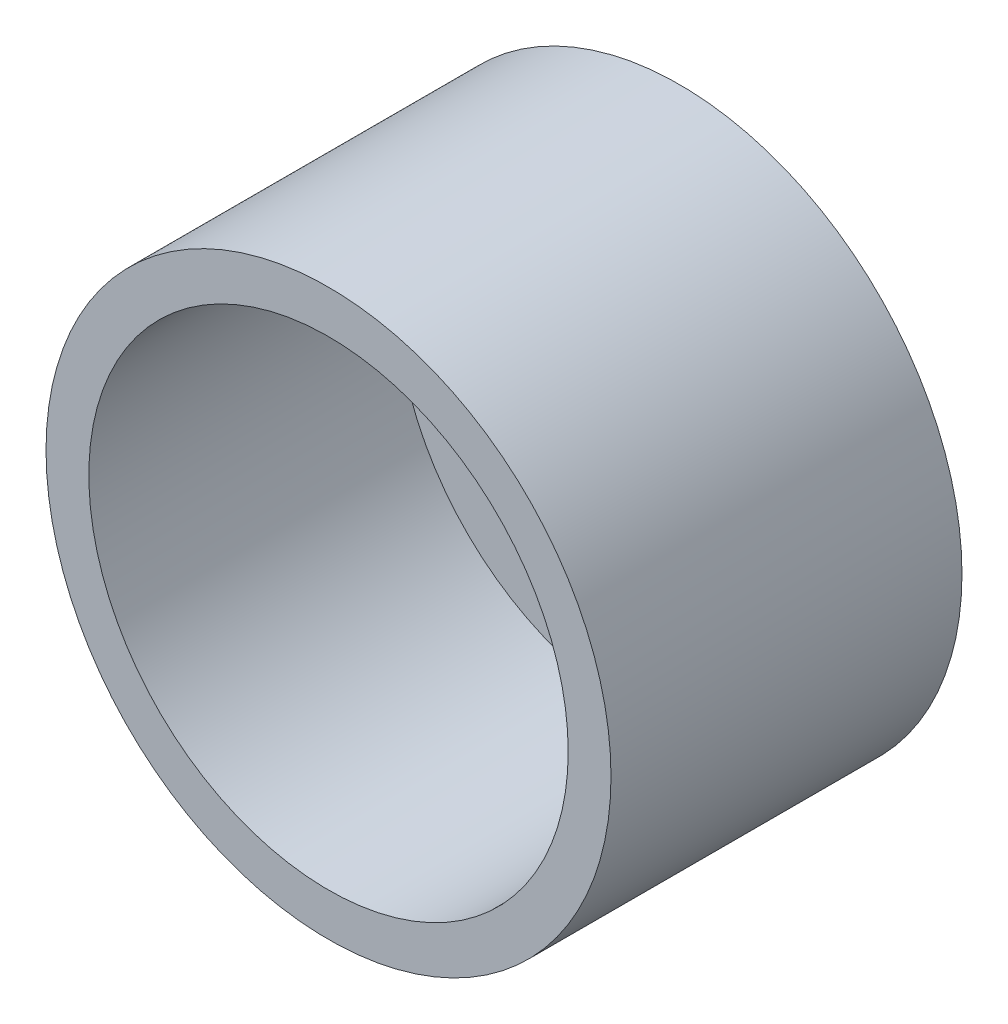
ISO-10303-21;
HEADER;
FILE_DESCRIPTION(('STEP AP214'),'2;1');
FILE_NAME('part.step','',(''),(''),'','','');
FILE_SCHEMA(('AUTOMOTIVE_DESIGN { 1 0 10303 214 1 1 1 1 }'));
ENDSEC;
DATA;
#1=APPLICATION_CONTEXT('core data for automotive mechanical design processes');
#2=APPLICATION_PROTOCOL_DEFINITION('international standard','automotive_design',2000,#1);
#3=PRODUCT_CONTEXT('',#1,'mechanical');
#4=PRODUCT('Part','Part','',(#3));
#5=PRODUCT_RELATED_PRODUCT_CATEGORY('part','',(#4));
#6=PRODUCT_DEFINITION_FORMATION('','',#4);
#7=PRODUCT_DEFINITION_CONTEXT('part definition',#1,'design');
#8=PRODUCT_DEFINITION('design','',#6,#7);
#9=PRODUCT_DEFINITION_SHAPE('','',#8);
#10=(LENGTH_UNIT() NAMED_UNIT(*) SI_UNIT(.MILLI.,.METRE.));
#11=(NAMED_UNIT(*) PLANE_ANGLE_UNIT() SI_UNIT($,.RADIAN.));
#12=(NAMED_UNIT(*) SI_UNIT($,.STERADIAN.) SOLID_ANGLE_UNIT());
#13=UNCERTAINTY_MEASURE_WITH_UNIT(LENGTH_MEASURE(1.E-05),#10,'distance_accuracy_value','');
#14=(GEOMETRIC_REPRESENTATION_CONTEXT(3) GLOBAL_UNCERTAINTY_ASSIGNED_CONTEXT((#13)) GLOBAL_UNIT_ASSIGNED_CONTEXT((#10,
#11,#12)) REPRESENTATION_CONTEXT('',''));
#15=CARTESIAN_POINT('',(0.,0.,0.));
#16=DIRECTION('',(0.,0.,1.));
#17=DIRECTION('',(1.,0.,0.));
#18=AXIS2_PLACEMENT_3D('',#15,#16,#17);
#19=CARTESIAN_POINT('',(0.,0.,18.));
#20=DIRECTION('',(0.,0.,-1.));
#21=DIRECTION('',(-1.,0.,0.));
#22=AXIS2_PLACEMENT_3D('',#19,#20,#21);
#23=CYLINDRICAL_SURFACE('',#22,16.5);
#24=CARTESIAN_POINT('',(0.,0.,18.));
#25=DIRECTION('',(0.,0.,1.));
#26=DIRECTION('',(1.,0.,0.));
#27=AXIS2_PLACEMENT_3D('',#24,#25,#26);
#28=CIRCLE('',#27,16.5);
#29=CARTESIAN_POINT('',(16.5,0.,18.));
#30=VERTEX_POINT('',#29);
#31=EDGE_CURVE('E10',#30,#30,#28,.T.);
#32=ORIENTED_EDGE('',*,*,#31,.F.);
#33=EDGE_LOOP('',(#32));
#34=FACE_BOUND('',#33,.T.);
#35=CARTESIAN_POINT('',(0.,0.,-2.5));
#36=DIRECTION('',(0.,0.,1.));
#37=DIRECTION('',(1.,0.,0.));
#38=AXIS2_PLACEMENT_3D('',#35,#36,#37);
#39=CIRCLE('',#38,16.5);
#40=CARTESIAN_POINT('',(16.5,0.,-2.5));
#41=VERTEX_POINT('',#40);
#42=EDGE_CURVE('E51',#41,#41,#39,.T.);
#43=ORIENTED_EDGE('',*,*,#42,.T.);
#44=EDGE_LOOP('',(#43));
#45=FACE_BOUND('',#44,.T.);
#46=ADVANCED_FACE('F43',(#34,#45),#23,.T.);
#47=CARTESIAN_POINT('',(0.,0.,18.));
#48=DIRECTION('',(0.,0.,1.));
#49=DIRECTION('',(1.,0.,0.));
#50=AXIS2_PLACEMENT_3D('',#47,#48,#49);
#51=PLANE('',#50);
#52=CARTESIAN_POINT('',(0.,0.,18.));
#53=DIRECTION('',(0.,0.,1.));
#54=DIRECTION('',(1.,0.,0.));
#55=AXIS2_PLACEMENT_3D('',#52,#53,#54);
#56=CIRCLE('',#55,14.);
#57=CARTESIAN_POINT('',(14.,0.,18.));
#58=VERTEX_POINT('',#57);
#59=EDGE_CURVE('E56',#58,#58,#56,.T.);
#60=ORIENTED_EDGE('',*,*,#59,.F.);
#61=EDGE_LOOP('',(#60));
#62=FACE_BOUND('',#61,.T.);
#63=ORIENTED_EDGE('',*,*,#31,.T.);
#64=EDGE_LOOP('',(#63));
#65=FACE_BOUND('',#64,.T.);
#66=ADVANCED_FACE('F79',(#62,#65),#51,.T.);
#67=CARTESIAN_POINT('',(0.,0.,-2.5));
#68=DIRECTION('',(0.,0.,1.));
#69=DIRECTION('',(1.,0.,0.));
#70=AXIS2_PLACEMENT_3D('',#67,#68,#69);
#71=PLANE('',#70);
#72=ORIENTED_EDGE('',*,*,#42,.F.);
#73=EDGE_LOOP('',(#72));
#74=FACE_BOUND('',#73,.T.);
#75=ADVANCED_FACE('F45',(#74),#71,.F.);
#76=CARTESIAN_POINT('',(0.,0.,18.));
#77=DIRECTION('',(0.,0.,-1.));
#78=DIRECTION('',(-1.,0.,0.));
#79=AXIS2_PLACEMENT_3D('',#76,#77,#78);
#80=CYLINDRICAL_SURFACE('',#79,14.);
#81=ORIENTED_EDGE('',*,*,#59,.T.);
#82=EDGE_LOOP('',(#81));
#83=FACE_BOUND('',#82,.T.);
#84=CARTESIAN_POINT('',(0.,0.,0.));
#85=DIRECTION('',(0.,0.,1.));
#86=DIRECTION('',(1.,0.,0.));
#87=AXIS2_PLACEMENT_3D('',#84,#85,#86);
#88=CIRCLE('',#87,14.);
#89=CARTESIAN_POINT('',(14.,0.,0.));
#90=VERTEX_POINT('',#89);
#91=EDGE_CURVE('E61',#90,#90,#88,.T.);
#92=ORIENTED_EDGE('',*,*,#91,.F.);
#93=EDGE_LOOP('',(#92));
#94=FACE_BOUND('',#93,.T.);
#95=ADVANCED_FACE('F70',(#83,#94),#80,.F.);
#96=CARTESIAN_POINT('',(0.,0.,0.));
#97=DIRECTION('',(0.,0.,1.));
#98=DIRECTION('',(1.,0.,0.));
#99=AXIS2_PLACEMENT_3D('',#96,#97,#98);
#100=PLANE('',#99);
#101=ORIENTED_EDGE('',*,*,#91,.T.);
#102=EDGE_LOOP('',(#101));
#103=FACE_BOUND('',#102,.T.);
#104=ADVANCED_FACE('F68',(#103),#100,.T.);
#105=CLOSED_SHELL('',(#46,#66,#75,#95,#104));
#106=MANIFOLD_SOLID_BREP('B2',#105);
#107=ADVANCED_BREP_SHAPE_REPRESENTATION('',(#18,#106),#14);
#108=SHAPE_DEFINITION_REPRESENTATION(#9,#107);
ENDSEC;
END-ISO-10303-21;
